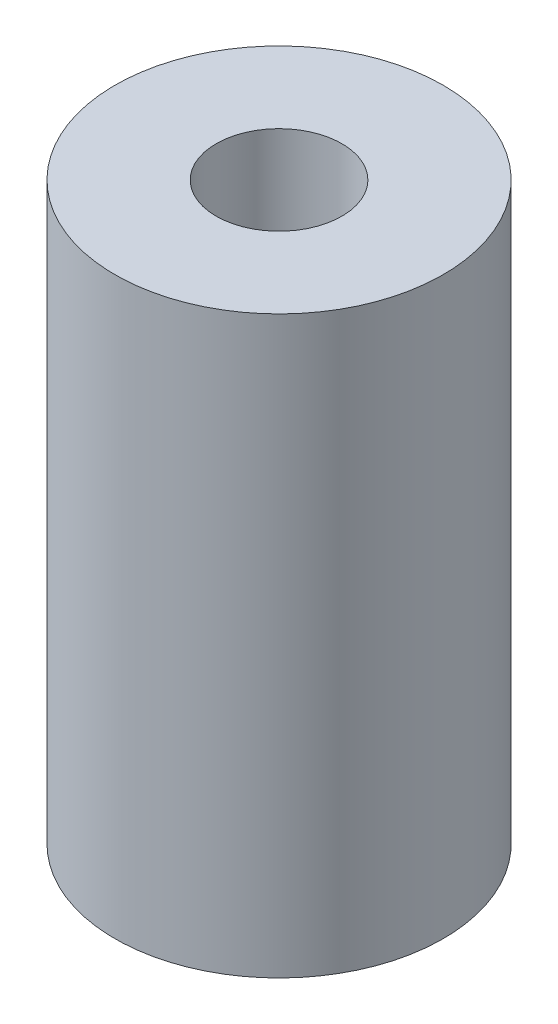
ISO-10303-21;
HEADER;
FILE_DESCRIPTION(('STEP AP214'),'2;1');
FILE_NAME('part.step','',(''),(''),'','','');
FILE_SCHEMA(('AUTOMOTIVE_DESIGN { 1 0 10303 214 1 1 1 1 }'));
ENDSEC;
DATA;
#1=APPLICATION_CONTEXT('core data for automotive mechanical design processes');
#2=APPLICATION_PROTOCOL_DEFINITION('international standard','automotive_design',2000,#1);
#3=PRODUCT_CONTEXT('',#1,'mechanical');
#4=PRODUCT('Part','Part','',(#3));
#5=PRODUCT_RELATED_PRODUCT_CATEGORY('part','',(#4));
#6=PRODUCT_DEFINITION_FORMATION('','',#4);
#7=PRODUCT_DEFINITION_CONTEXT('part definition',#1,'design');
#8=PRODUCT_DEFINITION('design','',#6,#7);
#9=PRODUCT_DEFINITION_SHAPE('','',#8);
#10=(LENGTH_UNIT() NAMED_UNIT(*) SI_UNIT(.MILLI.,.METRE.));
#11=(NAMED_UNIT(*) PLANE_ANGLE_UNIT() SI_UNIT($,.RADIAN.));
#12=(NAMED_UNIT(*) SI_UNIT($,.STERADIAN.) SOLID_ANGLE_UNIT());
#13=UNCERTAINTY_MEASURE_WITH_UNIT(LENGTH_MEASURE(1.E-05),#10,'distance_accuracy_value','');
#14=(GEOMETRIC_REPRESENTATION_CONTEXT(3) GLOBAL_UNCERTAINTY_ASSIGNED_CONTEXT((#13)) GLOBAL_UNIT_ASSIGNED_CONTEXT((#10,
#11,#12)) REPRESENTATION_CONTEXT('',''));
#15=CARTESIAN_POINT('',(0.,0.,0.));
#16=DIRECTION('',(0.,0.,1.));
#17=DIRECTION('',(1.,0.,0.));
#18=AXIS2_PLACEMENT_3D('',#15,#16,#17);
#19=CARTESIAN_POINT('',(0.,82.35,0.));
#20=DIRECTION('',(0.,-1.,0.));
#21=DIRECTION('',(0.,0.,-1.));
#22=AXIS2_PLACEMENT_3D('',#19,#20,#21);
#23=CYLINDRICAL_SURFACE('',#22,23.5);
#24=CARTESIAN_POINT('',(0.,82.35,0.));
#25=DIRECTION('',(0.,1.,0.));
#26=DIRECTION('',(0.,0.,1.));
#27=AXIS2_PLACEMENT_3D('',#24,#25,#26);
#28=CIRCLE('',#27,23.5);
#29=CARTESIAN_POINT('',(0.,82.35,-23.5));
#30=VERTEX_POINT('',#29);
#31=EDGE_CURVE('E10',#30,#30,#28,.T.);
#32=CARTESIAN_POINT('',(0.,0.,0.));
#33=DIRECTION('',(0.,1.,0.));
#34=DIRECTION('',(0.,0.,1.));
#35=AXIS2_PLACEMENT_3D('',#32,#33,#34);
#36=CIRCLE('',#35,23.5);
#37=CARTESIAN_POINT('',(0.,0.,-23.5));
#38=VERTEX_POINT('',#37);
#39=EDGE_CURVE('E41',#38,#38,#36,.T.);
#40=CARTESIAN_POINT('',(0.,82.35,-23.5));
#41=CARTESIAN_POINT('',(0.,81.4921875,-23.5));
#42=CARTESIAN_POINT('',(0.,80.634375,-23.5));
#43=CARTESIAN_POINT('',(0.,78.91875,-23.5));
#44=CARTESIAN_POINT('',(0.,78.0609375,-23.5));
#45=CARTESIAN_POINT('',(0.,76.3453125,-23.5));
#46=CARTESIAN_POINT('',(0.,75.4875,-23.5));
#47=CARTESIAN_POINT('',(0.,73.771875,-23.5));
#48=CARTESIAN_POINT('',(0.,72.9140625,-23.5));
#49=CARTESIAN_POINT('',(0.,71.1984375,-23.5));
#50=CARTESIAN_POINT('',(0.,70.340625,-23.5));
#51=CARTESIAN_POINT('',(0.,68.625,-23.5));
#52=CARTESIAN_POINT('',(0.,67.7671875,-23.5));
#53=CARTESIAN_POINT('',(0.,66.0515625,-23.5));
#54=CARTESIAN_POINT('',(0.,65.19375,-23.5));
#55=CARTESIAN_POINT('',(0.,63.478125,-23.5));
#56=CARTESIAN_POINT('',(0.,62.6203125,-23.5));
#57=CARTESIAN_POINT('',(0.,60.9046875,-23.5));
#58=CARTESIAN_POINT('',(0.,60.046875,-23.5));
#59=CARTESIAN_POINT('',(0.,58.33125,-23.5));
#60=CARTESIAN_POINT('',(0.,57.4734375,-23.5));
#61=CARTESIAN_POINT('',(0.,55.7578125,-23.5));
#62=CARTESIAN_POINT('',(0.,54.9,-23.5));
#63=CARTESIAN_POINT('',(0.,53.184375,-23.5));
#64=CARTESIAN_POINT('',(0.,52.3265625,-23.5));
#65=CARTESIAN_POINT('',(0.,50.6109375,-23.5));
#66=CARTESIAN_POINT('',(0.,49.753125,-23.5));
#67=CARTESIAN_POINT('',(0.,48.0375,-23.5));
#68=CARTESIAN_POINT('',(0.,47.1796875,-23.5));
#69=CARTESIAN_POINT('',(0.,45.4640625,-23.5));
#70=CARTESIAN_POINT('',(0.,44.60625,-23.5));
#71=CARTESIAN_POINT('',(0.,42.890625,-23.5));
#72=CARTESIAN_POINT('',(0.,42.0328125,-23.5));
#73=CARTESIAN_POINT('',(0.,40.3171875,-23.5));
#74=CARTESIAN_POINT('',(0.,39.459375,-23.5));
#75=CARTESIAN_POINT('',(0.,37.74375,-23.5));
#76=CARTESIAN_POINT('',(0.,36.8859375,-23.5));
#77=CARTESIAN_POINT('',(0.,35.1703125,-23.5));
#78=CARTESIAN_POINT('',(0.,34.3125,-23.5));
#79=CARTESIAN_POINT('',(0.,32.596875,-23.5));
#80=CARTESIAN_POINT('',(0.,31.7390625,-23.5));
#81=CARTESIAN_POINT('',(0.,30.0234375,-23.5));
#82=CARTESIAN_POINT('',(0.,29.165625,-23.5));
#83=CARTESIAN_POINT('',(0.,27.45,-23.5));
#84=CARTESIAN_POINT('',(0.,26.5921875,-23.5));
#85=CARTESIAN_POINT('',(0.,24.8765625,-23.5));
#86=CARTESIAN_POINT('',(0.,24.01875,-23.5));
#87=CARTESIAN_POINT('',(0.,22.303125,-23.5));
#88=CARTESIAN_POINT('',(0.,21.4453125,-23.5));
#89=CARTESIAN_POINT('',(0.,19.7296875,-23.5));
#90=CARTESIAN_POINT('',(0.,18.871875,-23.5));
#91=CARTESIAN_POINT('',(0.,17.15625,-23.5));
#92=CARTESIAN_POINT('',(0.,16.2984375,-23.5));
#93=CARTESIAN_POINT('',(0.,14.5828125,-23.5));
#94=CARTESIAN_POINT('',(0.,13.725,-23.5));
#95=CARTESIAN_POINT('',(0.,12.009375,-23.5));
#96=CARTESIAN_POINT('',(0.,11.1515625,-23.5));
#97=CARTESIAN_POINT('',(0.,9.4359375,-23.5));
#98=CARTESIAN_POINT('',(0.,8.57812500000001,-23.5));
#99=CARTESIAN_POINT('',(0.,6.8625,-23.5));
#100=CARTESIAN_POINT('',(0.,6.0046875,-23.5));
#101=CARTESIAN_POINT('',(0.,4.2890625,-23.5));
#102=CARTESIAN_POINT('',(0.,3.43125,-23.5));
#103=CARTESIAN_POINT('',(0.,1.715625,-23.5));
#104=CARTESIAN_POINT('',(0.,0.857812499999998,-23.5));
#105=CARTESIAN_POINT('',(0.,0.,-23.5));
#106=B_SPLINE_CURVE_WITH_KNOTS('',3,(#40,#41,#42,#43,#44,#45,#46,#47,#48,#49,#50,#51,#52,#53,
#54,#55,#56,#57,#58,#59,#60,#61,#62,#63,#64,#65,#66,#67,#68,#69,#70,#71,#72,#73,#74,#75,#76,#77,
#78,#79,#80,#81,#82,#83,#84,#85,#86,#87,#88,#89,#90,#91,#92,#93,#94,#95,#96,#97,#98,#99,#100,
#101,#102,#103,#104,#105),.UNSPECIFIED.,.F.,.F.,(4,2,2,2,2,2,2,2,2,2,2,2,2,2,2,2,2,2,2,2,2,2,2,
2,2,2,2,2,2,2,2,2,4),(0.,2.57343750000001,5.14687500000001,7.72031250000001,10.29375,12.8671875,
15.440625,18.0140625,20.5875,23.1609375,25.734375,28.3078125,30.88125,33.4546875,36.028125,
38.6015625,41.175,43.7484375,46.321875,48.8953125,51.46875,54.0421875,56.615625,59.1890625,
61.7625,64.3359375,66.909375,69.4828125,72.05625,74.6296875,77.203125,79.7765625,82.35),.UNSPECIFIED.);
#107=EDGE_CURVE('BSEAM34',#30,#38,#106,.T.);
#108=ORIENTED_EDGE('',*,*,#31,.F.);
#109=ORIENTED_EDGE('',*,*,#39,.T.);
#110=ORIENTED_EDGE('',*,*,#107,.T.);
#111=ORIENTED_EDGE('',*,*,#107,.F.);
#112=EDGE_LOOP('',(#108,#110,#109,#111));
#113=FACE_BOUND('',#112,.T.);
#114=ADVANCED_FACE('F34',(#113),#23,.T.);
#115=CARTESIAN_POINT('',(0.,82.35,0.));
#116=DIRECTION('',(0.,1.,0.));
#117=DIRECTION('',(0.,0.,1.));
#118=AXIS2_PLACEMENT_3D('',#115,#116,#117);
#119=PLANE('',#118);
#120=CARTESIAN_POINT('',(0.,82.35,0.));
#121=DIRECTION('',(0.,1.,0.));
#122=DIRECTION('',(0.,0.,1.));
#123=AXIS2_PLACEMENT_3D('',#120,#121,#122);
#124=CIRCLE('',#123,9.);
#125=CARTESIAN_POINT('',(0.,82.35,9.));
#126=VERTEX_POINT('',#125);
#127=EDGE_CURVE('E47',#126,#126,#124,.T.);
#128=ORIENTED_EDGE('',*,*,#127,.F.);
#129=EDGE_LOOP('',(#128));
#130=FACE_BOUND('',#129,.T.);
#131=ORIENTED_EDGE('',*,*,#31,.T.);
#132=EDGE_LOOP('',(#131));
#133=FACE_BOUND('',#132,.T.);
#134=ADVANCED_FACE('F63',(#130,#133),#119,.T.);
#135=CARTESIAN_POINT('',(0.,0.,0.));
#136=DIRECTION('',(0.,1.,0.));
#137=DIRECTION('',(0.,0.,1.));
#138=AXIS2_PLACEMENT_3D('',#135,#136,#137);
#139=PLANE('',#138);
#140=CARTESIAN_POINT('',(0.,0.,0.));
#141=DIRECTION('',(0.,1.,0.));
#142=DIRECTION('',(0.,0.,1.));
#143=AXIS2_PLACEMENT_3D('',#140,#141,#142);
#144=CIRCLE('',#143,9.);
#145=CARTESIAN_POINT('',(0.,0.,9.));
#146=VERTEX_POINT('',#145);
#147=EDGE_CURVE('E37',#146,#146,#144,.T.);
#148=ORIENTED_EDGE('',*,*,#147,.T.);
#149=EDGE_LOOP('',(#148));
#150=FACE_BOUND('',#149,.T.);
#151=ORIENTED_EDGE('',*,*,#39,.F.);
#152=EDGE_LOOP('',(#151));
#153=FACE_BOUND('',#152,.T.);
#154=ADVANCED_FACE('F54',(#150,#153),#139,.F.);
#155=CARTESIAN_POINT('',(0.,-17.65,0.));
#156=DIRECTION('',(0.,1.,0.));
#157=DIRECTION('',(0.,0.,1.));
#158=AXIS2_PLACEMENT_3D('',#155,#156,#157);
#159=CYLINDRICAL_SURFACE('',#158,9.);
#160=ORIENTED_EDGE('',*,*,#127,.T.);
#161=EDGE_LOOP('',(#160));
#162=FACE_BOUND('',#161,.T.);
#163=ORIENTED_EDGE('',*,*,#147,.F.);
#164=EDGE_LOOP('',(#163));
#165=FACE_BOUND('',#164,.T.);
#166=ADVANCED_FACE('F57',(#162,#165),#159,.F.);
#167=CLOSED_SHELL('',(#114,#134,#154,#166));
#168=MANIFOLD_SOLID_BREP('B2',#167);
#169=ADVANCED_BREP_SHAPE_REPRESENTATION('',(#18,#168),#14);
#170=SHAPE_DEFINITION_REPRESENTATION(#9,#169);
ENDSEC;
END-ISO-10303-21;
